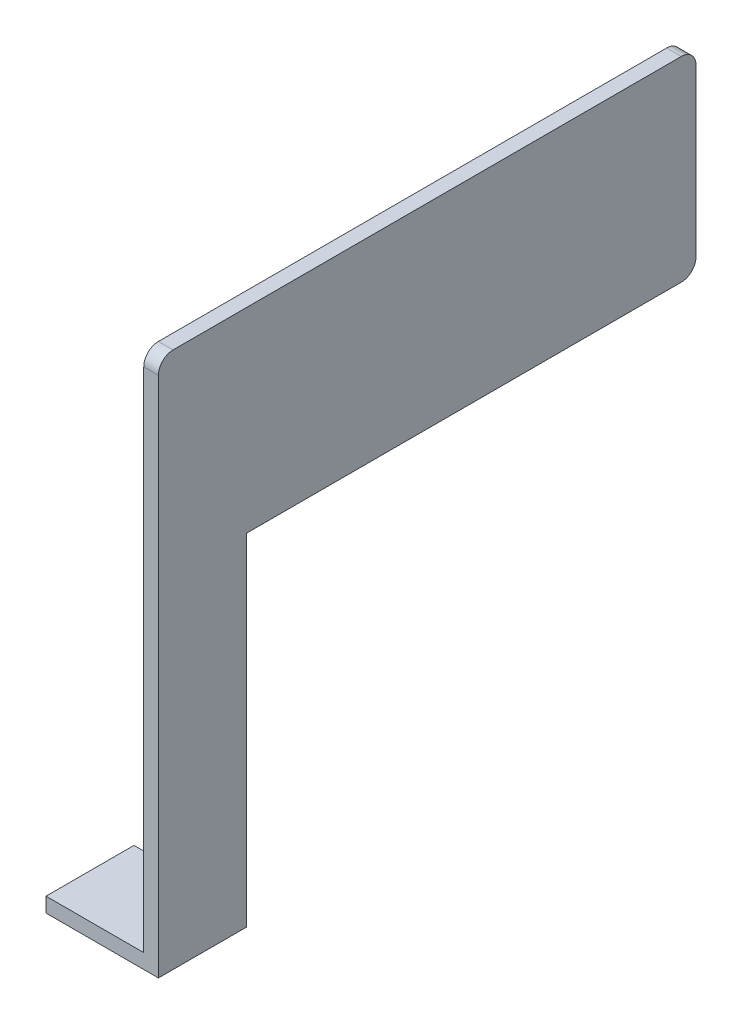
ISO-10303-21;
HEADER;
FILE_DESCRIPTION(('STEP AP214'),'2;1');
FILE_NAME('part.step','',(''),(''),'','','');
FILE_SCHEMA(('AUTOMOTIVE_DESIGN { 1 0 10303 214 1 1 1 1 }'));
ENDSEC;
DATA;
#1=APPLICATION_CONTEXT('core data for automotive mechanical design processes');
#2=APPLICATION_PROTOCOL_DEFINITION('international standard','automotive_design',2000,#1);
#3=PRODUCT_CONTEXT('',#1,'mechanical');
#4=PRODUCT('Part','Part','',(#3));
#5=PRODUCT_RELATED_PRODUCT_CATEGORY('part','',(#4));
#6=PRODUCT_DEFINITION_FORMATION('','',#4);
#7=PRODUCT_DEFINITION_CONTEXT('part definition',#1,'design');
#8=PRODUCT_DEFINITION('design','',#6,#7);
#9=PRODUCT_DEFINITION_SHAPE('','',#8);
#10=(LENGTH_UNIT() NAMED_UNIT(*) SI_UNIT(.MILLI.,.METRE.));
#11=(NAMED_UNIT(*) PLANE_ANGLE_UNIT() SI_UNIT($,.RADIAN.));
#12=(NAMED_UNIT(*) SI_UNIT($,.STERADIAN.) SOLID_ANGLE_UNIT());
#13=UNCERTAINTY_MEASURE_WITH_UNIT(LENGTH_MEASURE(1.E-05),#10,'distance_accuracy_value','');
#14=(GEOMETRIC_REPRESENTATION_CONTEXT(3) GLOBAL_UNCERTAINTY_ASSIGNED_CONTEXT((#13)) GLOBAL_UNIT_ASSIGNED_CONTEXT((#10,
#11,#12)) REPRESENTATION_CONTEXT('',''));
#15=CARTESIAN_POINT('',(0.,0.,0.));
#16=DIRECTION('',(0.,0.,1.));
#17=DIRECTION('',(1.,0.,0.));
#18=AXIS2_PLACEMENT_3D('',#15,#16,#17);
#19=CARTESIAN_POINT('',(0.3,2.,5.5));
#20=DIRECTION('',(0.,-1.,0.));
#21=DIRECTION('',(0.,0.,-1.));
#22=AXIS2_PLACEMENT_3D('',#19,#20,#21);
#23=PLANE('',#22);
#24=DIRECTION('',(0.,0.,1.));
#25=VECTOR('',#24,1.);
#26=CARTESIAN_POINT('',(0.3,2.,5.5));
#27=LINE('',#26,#25);
#28=CARTESIAN_POINT('',(0.3,2.,-5.2));
#29=VERTEX_POINT('',#28);
#30=CARTESIAN_POINT('',(0.3,2.,5.2));
#31=VERTEX_POINT('',#30);
#32=EDGE_CURVE('E170',#29,#31,#27,.T.);
#33=ORIENTED_EDGE('',*,*,#32,.F.);
#34=DIRECTION('',(-1.,0.,0.));
#35=VECTOR('',#34,1.);
#36=CARTESIAN_POINT('',(0.3,2.,-5.2));
#37=LINE('',#36,#35);
#38=CARTESIAN_POINT('',(0.,2.,-5.2));
#39=VERTEX_POINT('',#38);
#40=EDGE_CURVE('E51',#29,#39,#37,.T.);
#41=ORIENTED_EDGE('',*,*,#40,.T.);
#42=DIRECTION('',(0.,0.,1.));
#43=VECTOR('',#42,1.);
#44=CARTESIAN_POINT('',(0.,2.,5.5));
#45=LINE('',#44,#43);
#46=CARTESIAN_POINT('',(0.,2.,5.2));
#47=VERTEX_POINT('',#46);
#48=EDGE_CURVE('E166',#39,#47,#45,.T.);
#49=ORIENTED_EDGE('',*,*,#48,.T.);
#50=DIRECTION('',(-1.,0.,0.));
#51=VECTOR('',#50,1.);
#52=CARTESIAN_POINT('',(0.3,2.,5.2));
#53=LINE('',#52,#51);
#54=EDGE_CURVE('E66',#47,#31,#53,.F.);
#55=ORIENTED_EDGE('',*,*,#54,.T.);
#56=EDGE_LOOP('',(#33,#41,#49,#55));
#57=FACE_BOUND('',#56,.T.);
#58=ADVANCED_FACE('F43',(#57),#23,.F.);
#59=CARTESIAN_POINT('',(0.3,-2.,5.5));
#60=DIRECTION('',(0.,0.,-1.));
#61=DIRECTION('',(0.,1.,0.));
#62=AXIS2_PLACEMENT_3D('',#59,#60,#61);
#63=PLANE('',#62);
#64=DIRECTION('',(0.,-1.,0.));
#65=VECTOR('',#64,1.);
#66=CARTESIAN_POINT('',(0.3,1.5,5.5));
#67=LINE('',#66,#65);
#68=CARTESIAN_POINT('',(0.3,1.7,5.5));
#69=VERTEX_POINT('',#68);
#70=CARTESIAN_POINT('',(0.3,-8.98,5.5));
#71=VERTEX_POINT('',#70);
#72=EDGE_CURVE('E173',#69,#71,#67,.T.);
#73=ORIENTED_EDGE('',*,*,#72,.F.);
#74=DIRECTION('',(-1.,0.,0.));
#75=VECTOR('',#74,1.);
#76=CARTESIAN_POINT('',(0.3,1.7,5.5));
#77=LINE('',#76,#75);
#78=CARTESIAN_POINT('',(0.,1.7,5.5));
#79=VERTEX_POINT('',#78);
#80=EDGE_CURVE('E11',#69,#79,#77,.T.);
#81=ORIENTED_EDGE('',*,*,#80,.T.);
#82=DIRECTION('',(0.,-1.,0.));
#83=VECTOR('',#82,1.);
#84=CARTESIAN_POINT('',(0.,-2.,5.5));
#85=LINE('',#84,#83);
#86=CARTESIAN_POINT('',(0.,-8.68,5.5));
#87=VERTEX_POINT('',#86);
#88=EDGE_CURVE('E182',#79,#87,#85,.T.);
#89=ORIENTED_EDGE('',*,*,#88,.T.);
#90=DIRECTION('',(1.,0.,0.));
#91=VECTOR('',#90,1.);
#92=CARTESIAN_POINT('',(-2.,-8.68,5.5));
#93=LINE('',#92,#91);
#94=CARTESIAN_POINT('',(-2.,-8.68,5.5));
#95=VERTEX_POINT('',#94);
#96=EDGE_CURVE('E163',#95,#87,#93,.T.);
#97=ORIENTED_EDGE('',*,*,#96,.F.);
#98=DIRECTION('',(0.,1.,0.));
#99=VECTOR('',#98,1.);
#100=CARTESIAN_POINT('',(-2.,-8.98,5.5));
#101=LINE('',#100,#99);
#102=CARTESIAN_POINT('',(-2.,-8.98,5.5));
#103=VERTEX_POINT('',#102);
#104=EDGE_CURVE('E148',#103,#95,#101,.T.);
#105=ORIENTED_EDGE('',*,*,#104,.F.);
#106=DIRECTION('',(-1.,0.,0.));
#107=VECTOR('',#106,1.);
#108=CARTESIAN_POINT('',(0.3,-8.98,5.5));
#109=LINE('',#108,#107);
#110=EDGE_CURVE('E139',#71,#103,#109,.T.);
#111=ORIENTED_EDGE('',*,*,#110,.F.);
#112=EDGE_LOOP('',(#73,#81,#89,#97,#105,#111));
#113=FACE_BOUND('',#112,.T.);
#114=ADVANCED_FACE('F225',(#113),#63,.F.);
#115=CARTESIAN_POINT('',(0.3,-8.98,5.5));
#116=DIRECTION('',(0.,1.,0.));
#117=DIRECTION('',(0.,0.,1.));
#118=AXIS2_PLACEMENT_3D('',#115,#116,#117);
#119=PLANE('',#118);
#120=ORIENTED_EDGE('',*,*,#110,.T.);
#121=DIRECTION('',(0.,0.,1.));
#122=VECTOR('',#121,1.);
#123=CARTESIAN_POINT('',(-2.,-8.98,3.7));
#124=LINE('',#123,#122);
#125=CARTESIAN_POINT('',(-2.,-8.98,3.7));
#126=VERTEX_POINT('',#125);
#127=EDGE_CURVE('E143',#126,#103,#124,.T.);
#128=ORIENTED_EDGE('',*,*,#127,.F.);
#129=DIRECTION('',(-1.,0.,0.));
#130=VECTOR('',#129,1.);
#131=CARTESIAN_POINT('',(0.3,-8.98,3.7));
#132=LINE('',#131,#130);
#133=CARTESIAN_POINT('',(0.3,-8.98,3.7));
#134=VERTEX_POINT('',#133);
#135=EDGE_CURVE('E129',#134,#126,#132,.T.);
#136=ORIENTED_EDGE('',*,*,#135,.F.);
#137=DIRECTION('',(0.,0.,-1.));
#138=VECTOR('',#137,1.);
#139=CARTESIAN_POINT('',(0.3,-8.98,5.5));
#140=LINE('',#139,#138);
#141=EDGE_CURVE('E175',#71,#134,#140,.T.);
#142=ORIENTED_EDGE('',*,*,#141,.F.);
#143=EDGE_LOOP('',(#120,#128,#136,#142));
#144=FACE_BOUND('',#143,.T.);
#145=ADVANCED_FACE('F144',(#144),#119,.F.);
#146=CARTESIAN_POINT('',(0.3,-8.98,3.7));
#147=DIRECTION('',(0.,0.,1.));
#148=DIRECTION('',(1.,0.,0.));
#149=AXIS2_PLACEMENT_3D('',#146,#147,#148);
#150=PLANE('',#149);
#151=ORIENTED_EDGE('',*,*,#135,.T.);
#152=DIRECTION('',(0.,-1.,0.));
#153=VECTOR('',#152,1.);
#154=CARTESIAN_POINT('',(-2.,-8.98,3.7));
#155=LINE('',#154,#153);
#156=CARTESIAN_POINT('',(-2.,-8.68,3.7));
#157=VERTEX_POINT('',#156);
#158=EDGE_CURVE('E134',#157,#126,#155,.T.);
#159=ORIENTED_EDGE('',*,*,#158,.F.);
#160=DIRECTION('',(1.,0.,0.));
#161=VECTOR('',#160,1.);
#162=CARTESIAN_POINT('',(-2.,-8.68,3.7));
#163=LINE('',#162,#161);
#164=CARTESIAN_POINT('',(0.,-8.68,3.7));
#165=VERTEX_POINT('',#164);
#166=EDGE_CURVE('E160',#157,#165,#163,.T.);
#167=ORIENTED_EDGE('',*,*,#166,.T.);
#168=DIRECTION('',(0.,1.,0.));
#169=VECTOR('',#168,1.);
#170=CARTESIAN_POINT('',(0.,-8.98,3.7));
#171=LINE('',#170,#169);
#172=CARTESIAN_POINT('',(0.,-2.,3.7));
#173=VERTEX_POINT('',#172);
#174=EDGE_CURVE('E184',#165,#173,#171,.T.);
#175=ORIENTED_EDGE('',*,*,#174,.T.);
#176=DIRECTION('',(-1.,0.,0.));
#177=VECTOR('',#176,1.);
#178=CARTESIAN_POINT('',(0.3,-2.,3.7));
#179=LINE('',#178,#177);
#180=CARTESIAN_POINT('',(0.3,-2.,3.7));
#181=VERTEX_POINT('',#180);
#182=EDGE_CURVE('E140',#181,#173,#179,.T.);
#183=ORIENTED_EDGE('',*,*,#182,.F.);
#184=DIRECTION('',(0.,1.,0.));
#185=VECTOR('',#184,1.);
#186=CARTESIAN_POINT('',(0.3,-8.98,3.7));
#187=LINE('',#186,#185);
#188=EDGE_CURVE('E136',#134,#181,#187,.T.);
#189=ORIENTED_EDGE('',*,*,#188,.F.);
#190=EDGE_LOOP('',(#151,#159,#167,#175,#183,#189));
#191=FACE_BOUND('',#190,.T.);
#192=ADVANCED_FACE('F131',(#191),#150,.F.);
#193=CARTESIAN_POINT('',(0.3,-2.,3.7));
#194=DIRECTION('',(0.,1.,0.));
#195=DIRECTION('',(0.,0.,1.));
#196=AXIS2_PLACEMENT_3D('',#193,#194,#195);
#197=PLANE('',#196);
#198=DIRECTION('',(0.,0.,-1.));
#199=VECTOR('',#198,1.);
#200=CARTESIAN_POINT('',(0.,-2.,3.7));
#201=LINE('',#200,#199);
#202=CARTESIAN_POINT('',(0.,-2.,-5.2));
#203=VERTEX_POINT('',#202);
#204=EDGE_CURVE('E186',#173,#203,#201,.T.);
#205=ORIENTED_EDGE('',*,*,#204,.T.);
#206=DIRECTION('',(-1.,0.,0.));
#207=VECTOR('',#206,1.);
#208=CARTESIAN_POINT('',(0.3,-2.,-5.2));
#209=LINE('',#208,#207);
#210=CARTESIAN_POINT('',(0.3,-2.,-5.2));
#211=VERTEX_POINT('',#210);
#212=EDGE_CURVE('E205',#203,#211,#209,.F.);
#213=ORIENTED_EDGE('',*,*,#212,.T.);
#214=DIRECTION('',(0.,0.,-1.));
#215=VECTOR('',#214,1.);
#216=CARTESIAN_POINT('',(0.3,-2.,3.7));
#217=LINE('',#216,#215);
#218=EDGE_CURVE('E178',#181,#211,#217,.T.);
#219=ORIENTED_EDGE('',*,*,#218,.F.);
#220=ORIENTED_EDGE('',*,*,#182,.T.);
#221=EDGE_LOOP('',(#205,#213,#219,#220));
#222=FACE_BOUND('',#221,.T.);
#223=ADVANCED_FACE('F232',(#222),#197,.F.);
#224=CARTESIAN_POINT('',(0.3,1.5,-5.5));
#225=DIRECTION('',(0.,0.,1.));
#226=DIRECTION('',(1.,0.,0.));
#227=AXIS2_PLACEMENT_3D('',#224,#225,#226);
#228=PLANE('',#227);
#229=DIRECTION('',(0.,1.,0.));
#230=VECTOR('',#229,1.);
#231=CARTESIAN_POINT('',(0.3,1.5,-5.5));
#232=LINE('',#231,#230);
#233=CARTESIAN_POINT('',(0.3,-1.7,-5.5));
#234=VERTEX_POINT('',#233);
#235=CARTESIAN_POINT('',(0.3,1.7,-5.5));
#236=VERTEX_POINT('',#235);
#237=EDGE_CURVE('E167',#234,#236,#232,.T.);
#238=ORIENTED_EDGE('',*,*,#237,.F.);
#239=DIRECTION('',(-1.,0.,0.));
#240=VECTOR('',#239,1.);
#241=CARTESIAN_POINT('',(0.3,-1.7,-5.5));
#242=LINE('',#241,#240);
#243=CARTESIAN_POINT('',(0.,-1.7,-5.5));
#244=VERTEX_POINT('',#243);
#245=EDGE_CURVE('E196',#234,#244,#242,.T.);
#246=ORIENTED_EDGE('',*,*,#245,.T.);
#247=DIRECTION('',(0.,1.,0.));
#248=VECTOR('',#247,1.);
#249=CARTESIAN_POINT('',(0.,1.5,-5.5));
#250=LINE('',#249,#248);
#251=CARTESIAN_POINT('',(0.,1.7,-5.5));
#252=VERTEX_POINT('',#251);
#253=EDGE_CURVE('E171',#244,#252,#250,.T.);
#254=ORIENTED_EDGE('',*,*,#253,.T.);
#255=DIRECTION('',(-1.,0.,0.));
#256=VECTOR('',#255,1.);
#257=CARTESIAN_POINT('',(0.3,1.7,-5.5));
#258=LINE('',#257,#256);
#259=EDGE_CURVE('E194',#252,#236,#258,.F.);
#260=ORIENTED_EDGE('',*,*,#259,.T.);
#261=EDGE_LOOP('',(#238,#246,#254,#260));
#262=FACE_BOUND('',#261,.T.);
#263=ADVANCED_FACE('F239',(#262),#228,.F.);
#264=CARTESIAN_POINT('',(0.3,0.,0.));
#265=DIRECTION('',(-1.,0.,0.));
#266=DIRECTION('',(0.,0.,1.));
#267=AXIS2_PLACEMENT_3D('',#264,#265,#266);
#268=PLANE('',#267);
#269=ORIENTED_EDGE('',*,*,#218,.T.);
#270=CARTESIAN_POINT('',(0.3,-1.7,-5.2));
#271=DIRECTION('',(-1.,0.,0.));
#272=DIRECTION('',(0.,0.,1.));
#273=AXIS2_PLACEMENT_3D('',#270,#271,#272);
#274=CIRCLE('',#273,0.3);
#275=EDGE_CURVE('E210',#211,#234,#274,.F.);
#276=ORIENTED_EDGE('',*,*,#275,.T.);
#277=ORIENTED_EDGE('',*,*,#237,.T.);
#278=CARTESIAN_POINT('',(0.3,1.7,-5.2));
#279=DIRECTION('',(-1.,0.,0.));
#280=DIRECTION('',(0.,0.,1.));
#281=AXIS2_PLACEMENT_3D('',#278,#279,#280);
#282=CIRCLE('',#281,0.3);
#283=EDGE_CURVE('E208',#236,#29,#282,.F.);
#284=ORIENTED_EDGE('',*,*,#283,.T.);
#285=ORIENTED_EDGE('',*,*,#32,.T.);
#286=CARTESIAN_POINT('',(0.3,1.7,5.2));
#287=DIRECTION('',(-1.,0.,0.));
#288=DIRECTION('',(0.,0.,1.));
#289=AXIS2_PLACEMENT_3D('',#286,#287,#288);
#290=CIRCLE('',#289,0.3);
#291=EDGE_CURVE('E58',#31,#69,#290,.F.);
#292=ORIENTED_EDGE('',*,*,#291,.T.);
#293=ORIENTED_EDGE('',*,*,#72,.T.);
#294=ORIENTED_EDGE('',*,*,#141,.T.);
#295=ORIENTED_EDGE('',*,*,#188,.T.);
#296=EDGE_LOOP('',(#269,#276,#277,#284,#285,#292,#293,#294,#295));
#297=FACE_BOUND('',#296,.T.);
#298=ADVANCED_FACE('F227',(#297),#268,.F.);
#299=CARTESIAN_POINT('',(0.,0.,0.));
#300=DIRECTION('',(-1.,0.,0.));
#301=DIRECTION('',(0.,0.,1.));
#302=AXIS2_PLACEMENT_3D('',#299,#300,#301);
#303=PLANE('',#302);
#304=ORIENTED_EDGE('',*,*,#253,.F.);
#305=CARTESIAN_POINT('',(0.,-1.7,-5.2));
#306=DIRECTION('',(-1.,0.,0.));
#307=DIRECTION('',(0.,0.,1.));
#308=AXIS2_PLACEMENT_3D('',#305,#306,#307);
#309=CIRCLE('',#308,0.3);
#310=EDGE_CURVE('E203',#244,#203,#309,.T.);
#311=ORIENTED_EDGE('',*,*,#310,.T.);
#312=ORIENTED_EDGE('',*,*,#204,.F.);
#313=ORIENTED_EDGE('',*,*,#174,.F.);
#314=DIRECTION('',(0.,0.,-1.));
#315=VECTOR('',#314,1.);
#316=CARTESIAN_POINT('',(0.,-8.68,3.7));
#317=LINE('',#316,#315);
#318=EDGE_CURVE('E154',#87,#165,#317,.T.);
#319=ORIENTED_EDGE('',*,*,#318,.F.);
#320=ORIENTED_EDGE('',*,*,#88,.F.);
#321=CARTESIAN_POINT('',(0.,1.7,5.2));
#322=DIRECTION('',(-1.,0.,0.));
#323=DIRECTION('',(0.,0.,1.));
#324=AXIS2_PLACEMENT_3D('',#321,#322,#323);
#325=CIRCLE('',#324,0.3);
#326=EDGE_CURVE('E199',#79,#47,#325,.T.);
#327=ORIENTED_EDGE('',*,*,#326,.T.);
#328=ORIENTED_EDGE('',*,*,#48,.F.);
#329=CARTESIAN_POINT('',(0.,1.7,-5.2));
#330=DIRECTION('',(-1.,0.,0.));
#331=DIRECTION('',(0.,0.,1.));
#332=AXIS2_PLACEMENT_3D('',#329,#330,#331);
#333=CIRCLE('',#332,0.3);
#334=EDGE_CURVE('E201',#39,#252,#333,.T.);
#335=ORIENTED_EDGE('',*,*,#334,.T.);
#336=EDGE_LOOP('',(#304,#311,#312,#313,#319,#320,#327,#328,#335));
#337=FACE_BOUND('',#336,.T.);
#338=ADVANCED_FACE('F219',(#337),#303,.T.);
#339=CARTESIAN_POINT('',(-2.,-8.68,3.7));
#340=DIRECTION('',(0.,-1.,0.));
#341=DIRECTION('',(0.,0.,-1.));
#342=AXIS2_PLACEMENT_3D('',#339,#340,#341);
#343=PLANE('',#342);
#344=ORIENTED_EDGE('',*,*,#318,.T.);
#345=ORIENTED_EDGE('',*,*,#166,.F.);
#346=DIRECTION('',(0.,0.,-1.));
#347=VECTOR('',#346,1.);
#348=CARTESIAN_POINT('',(-2.,-8.68,3.7));
#349=LINE('',#348,#347);
#350=EDGE_CURVE('E152',#95,#157,#349,.T.);
#351=ORIENTED_EDGE('',*,*,#350,.F.);
#352=ORIENTED_EDGE('',*,*,#96,.T.);
#353=EDGE_LOOP('',(#344,#345,#351,#352));
#354=FACE_BOUND('',#353,.T.);
#355=ADVANCED_FACE('F265',(#354),#343,.F.);
#356=CARTESIAN_POINT('',(-2.,0.,0.));
#357=DIRECTION('',(1.,0.,0.));
#358=DIRECTION('',(0.,0.,-1.));
#359=AXIS2_PLACEMENT_3D('',#356,#357,#358);
#360=PLANE('',#359);
#361=ORIENTED_EDGE('',*,*,#158,.T.);
#362=ORIENTED_EDGE('',*,*,#127,.T.);
#363=ORIENTED_EDGE('',*,*,#104,.T.);
#364=ORIENTED_EDGE('',*,*,#350,.T.);
#365=EDGE_LOOP('',(#361,#362,#363,#364));
#366=FACE_BOUND('',#365,.T.);
#367=ADVANCED_FACE('F150',(#366),#360,.F.);
#368=CARTESIAN_POINT('',(0.3,-1.7,-5.2));
#369=DIRECTION('',(-1.,0.,0.));
#370=DIRECTION('',(0.,0.,1.));
#371=AXIS2_PLACEMENT_3D('',#368,#369,#370);
#372=CYLINDRICAL_SURFACE('',#371,0.3);
#373=ORIENTED_EDGE('',*,*,#275,.F.);
#374=ORIENTED_EDGE('',*,*,#212,.F.);
#375=ORIENTED_EDGE('',*,*,#310,.F.);
#376=ORIENTED_EDGE('',*,*,#245,.F.);
#377=EDGE_LOOP('',(#373,#374,#375,#376));
#378=FACE_BOUND('',#377,.T.);
#379=ADVANCED_FACE('F235',(#378),#372,.T.);
#380=CARTESIAN_POINT('',(0.3,1.7,-5.2));
#381=DIRECTION('',(-1.,0.,0.));
#382=DIRECTION('',(0.,0.,1.));
#383=AXIS2_PLACEMENT_3D('',#380,#381,#382);
#384=CYLINDRICAL_SURFACE('',#383,0.3);
#385=ORIENTED_EDGE('',*,*,#283,.F.);
#386=ORIENTED_EDGE('',*,*,#259,.F.);
#387=ORIENTED_EDGE('',*,*,#334,.F.);
#388=ORIENTED_EDGE('',*,*,#40,.F.);
#389=EDGE_LOOP('',(#385,#386,#387,#388));
#390=FACE_BOUND('',#389,.T.);
#391=ADVANCED_FACE('F241',(#390),#384,.T.);
#392=CARTESIAN_POINT('',(0.3,1.7,5.2));
#393=DIRECTION('',(-1.,0.,0.));
#394=DIRECTION('',(0.,0.,1.));
#395=AXIS2_PLACEMENT_3D('',#392,#393,#394);
#396=CYLINDRICAL_SURFACE('',#395,0.3);
#397=ORIENTED_EDGE('',*,*,#291,.F.);
#398=ORIENTED_EDGE('',*,*,#54,.F.);
#399=ORIENTED_EDGE('',*,*,#326,.F.);
#400=ORIENTED_EDGE('',*,*,#80,.F.);
#401=EDGE_LOOP('',(#397,#398,#399,#400));
#402=FACE_BOUND('',#401,.T.);
#403=ADVANCED_FACE('F45',(#402),#396,.T.);
#404=CLOSED_SHELL('',(#58,#114,#145,#192,#223,#263,#298,#338,#355,#367,#379,#391,#403));
#405=MANIFOLD_SOLID_BREP('B2',#404);
#406=ADVANCED_BREP_SHAPE_REPRESENTATION('',(#18,#405),#14);
#407=SHAPE_DEFINITION_REPRESENTATION(#9,#406);
ENDSEC;
END-ISO-10303-21;
